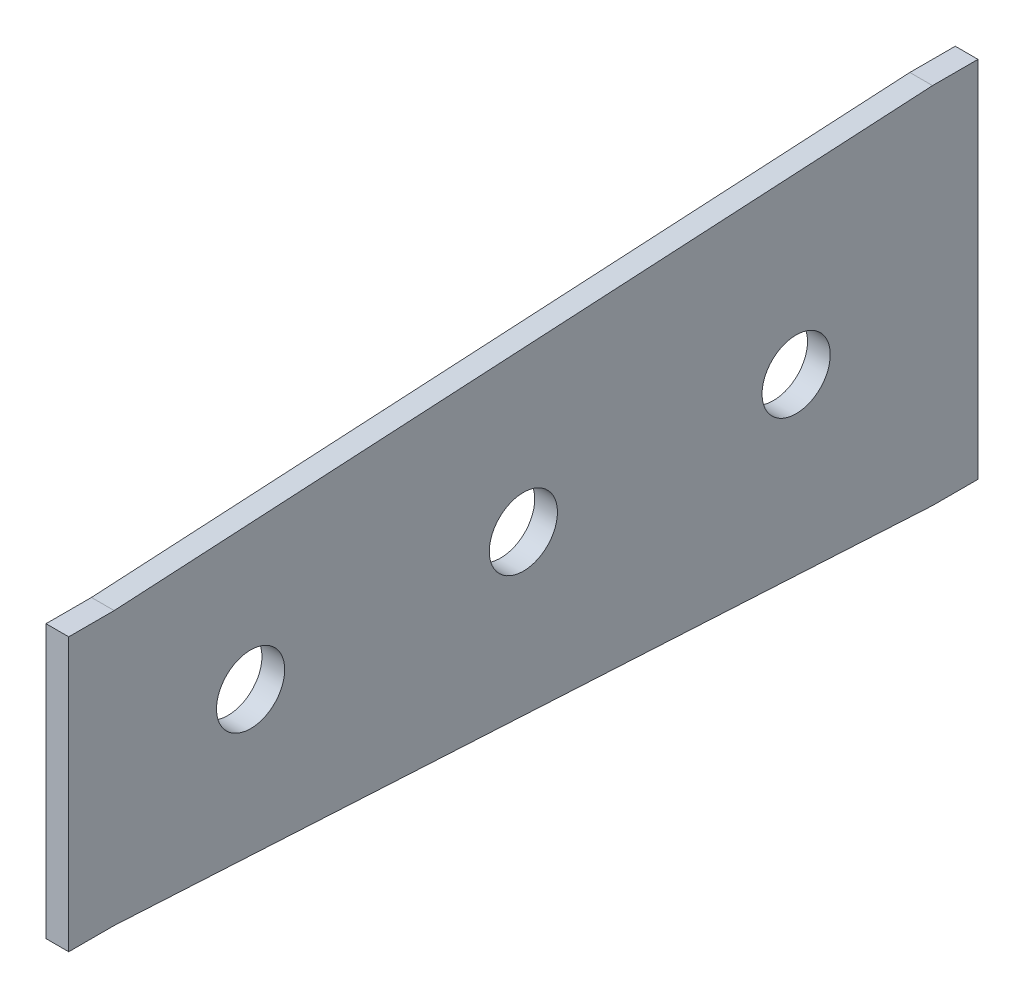
ISO-10303-21;
HEADER;
FILE_DESCRIPTION(('STEP AP214'),'2;1');
FILE_NAME('part.step','',(''),(''),'','','');
FILE_SCHEMA(('AUTOMOTIVE_DESIGN { 1 0 10303 214 1 1 1 1 }'));
ENDSEC;
DATA;
#1=APPLICATION_CONTEXT('core data for automotive mechanical design processes');
#2=APPLICATION_PROTOCOL_DEFINITION('international standard','automotive_design',2000,#1);
#3=PRODUCT_CONTEXT('',#1,'mechanical');
#4=PRODUCT('Part','Part','',(#3));
#5=PRODUCT_RELATED_PRODUCT_CATEGORY('part','',(#4));
#6=PRODUCT_DEFINITION_FORMATION('','',#4);
#7=PRODUCT_DEFINITION_CONTEXT('part definition',#1,'design');
#8=PRODUCT_DEFINITION('design','',#6,#7);
#9=PRODUCT_DEFINITION_SHAPE('','',#8);
#10=(LENGTH_UNIT() NAMED_UNIT(*) SI_UNIT(.MILLI.,.METRE.));
#11=(NAMED_UNIT(*) PLANE_ANGLE_UNIT() SI_UNIT($,.RADIAN.));
#12=(NAMED_UNIT(*) SI_UNIT($,.STERADIAN.) SOLID_ANGLE_UNIT());
#13=UNCERTAINTY_MEASURE_WITH_UNIT(LENGTH_MEASURE(1.E-05),#10,'distance_accuracy_value','');
#14=(GEOMETRIC_REPRESENTATION_CONTEXT(3) GLOBAL_UNCERTAINTY_ASSIGNED_CONTEXT((#13)) GLOBAL_UNIT_ASSIGNED_CONTEXT((#10,
#11,#12)) REPRESENTATION_CONTEXT('',''));
#15=CARTESIAN_POINT('',(0.,0.,0.));
#16=DIRECTION('',(0.,0.,1.));
#17=DIRECTION('',(1.,0.,0.));
#18=AXIS2_PLACEMENT_3D('',#15,#16,#17);
#19=CARTESIAN_POINT('',(2.5,0.,0.));
#20=DIRECTION('',(1.,0.,0.));
#21=DIRECTION('',(0.,0.,-1.));
#22=AXIS2_PLACEMENT_3D('',#19,#20,#21);
#23=PLANE('',#22);
#24=CARTESIAN_POINT('',(2.5,0.,60.));
#25=DIRECTION('',(1.,0.,0.));
#26=DIRECTION('',(0.,0.,-1.));
#27=AXIS2_PLACEMENT_3D('',#24,#25,#26);
#28=CIRCLE('',#27,7.50000000000001);
#29=CARTESIAN_POINT('',(2.5,0.,52.5));
#30=VERTEX_POINT('',#29);
#31=EDGE_CURVE('E188',#30,#30,#28,.T.);
#32=ORIENTED_EDGE('',*,*,#31,.F.);
#33=EDGE_LOOP('',(#32));
#34=FACE_BOUND('',#33,.T.);
#35=DIRECTION('',(0.,0.,1.));
#36=VECTOR('',#35,1.);
#37=CARTESIAN_POINT('',(2.5,30.,100.));
#38=LINE('',#37,#36);
#39=CARTESIAN_POINT('',(2.5,30.,90.));
#40=VERTEX_POINT('',#39);
#41=CARTESIAN_POINT('',(2.5,30.,100.));
#42=VERTEX_POINT('',#41);
#43=EDGE_CURVE('E150',#40,#42,#38,.T.);
#44=ORIENTED_EDGE('',*,*,#43,.T.);
#45=DIRECTION('',(0.,-1.,0.));
#46=VECTOR('',#45,1.);
#47=CARTESIAN_POINT('',(2.5,30.,100.));
#48=LINE('',#47,#46);
#49=CARTESIAN_POINT('',(2.5,-30.,100.));
#50=VERTEX_POINT('',#49);
#51=EDGE_CURVE('E97',#42,#50,#48,.T.);
#52=ORIENTED_EDGE('',*,*,#51,.T.);
#53=DIRECTION('',(0.,0.,-1.));
#54=VECTOR('',#53,1.);
#55=CARTESIAN_POINT('',(2.5,-30.,100.));
#56=LINE('',#55,#54);
#57=CARTESIAN_POINT('',(2.5,-30.,90.));
#58=VERTEX_POINT('',#57);
#59=EDGE_CURVE('E165',#50,#58,#56,.T.);
#60=ORIENTED_EDGE('',*,*,#59,.T.);
#61=DIRECTION('',(0.,-0.0554700196225229,-0.998460353205412));
#62=VECTOR('',#61,1.);
#63=CARTESIAN_POINT('',(2.5,-40.,-90.));
#64=LINE('',#63,#62);
#65=CARTESIAN_POINT('',(2.5,-40.,-90.));
#66=VERTEX_POINT('',#65);
#67=EDGE_CURVE('E178',#58,#66,#64,.T.);
#68=ORIENTED_EDGE('',*,*,#67,.T.);
#69=DIRECTION('',(0.,0.,-1.));
#70=VECTOR('',#69,1.);
#71=CARTESIAN_POINT('',(2.5,-40.,-100.));
#72=LINE('',#71,#70);
#73=CARTESIAN_POINT('',(2.5,-40.,-100.));
#74=VERTEX_POINT('',#73);
#75=EDGE_CURVE('E116',#66,#74,#72,.T.);
#76=ORIENTED_EDGE('',*,*,#75,.T.);
#77=DIRECTION('',(0.,1.,0.));
#78=VECTOR('',#77,1.);
#79=CARTESIAN_POINT('',(2.5,-40.,-100.));
#80=LINE('',#79,#78);
#81=CARTESIAN_POINT('',(2.5,40.,-100.));
#82=VERTEX_POINT('',#81);
#83=EDGE_CURVE('E110',#74,#82,#80,.T.);
#84=ORIENTED_EDGE('',*,*,#83,.T.);
#85=DIRECTION('',(0.,0.,1.));
#86=VECTOR('',#85,1.);
#87=CARTESIAN_POINT('',(2.5,40.,-100.));
#88=LINE('',#87,#86);
#89=CARTESIAN_POINT('',(2.5,40.,-90.));
#90=VERTEX_POINT('',#89);
#91=EDGE_CURVE('E114',#82,#90,#88,.T.);
#92=ORIENTED_EDGE('',*,*,#91,.T.);
#93=DIRECTION('',(0.,-0.0554700196225229,0.998460353205412));
#94=VECTOR('',#93,1.);
#95=CARTESIAN_POINT('',(2.5,40.,-90.));
#96=LINE('',#95,#94);
#97=EDGE_CURVE('E54',#90,#40,#96,.T.);
#98=ORIENTED_EDGE('',*,*,#97,.T.);
#99=EDGE_LOOP('',(#44,#52,#60,#68,#76,#84,#92,#98));
#100=FACE_BOUND('',#99,.T.);
#101=CARTESIAN_POINT('',(2.5,0.,0.));
#102=DIRECTION('',(1.,0.,0.));
#103=DIRECTION('',(0.,0.,-1.));
#104=AXIS2_PLACEMENT_3D('',#101,#102,#103);
#105=CIRCLE('',#104,7.5);
#106=CARTESIAN_POINT('',(2.5,0.,-7.5));
#107=VERTEX_POINT('',#106);
#108=EDGE_CURVE('E138',#107,#107,#105,.T.);
#109=ORIENTED_EDGE('',*,*,#108,.F.);
#110=EDGE_LOOP('',(#109));
#111=FACE_BOUND('',#110,.T.);
#112=CARTESIAN_POINT('',(2.5,0.,-60.));
#113=DIRECTION('',(1.,0.,0.));
#114=DIRECTION('',(0.,0.,-1.));
#115=AXIS2_PLACEMENT_3D('',#112,#113,#114);
#116=CIRCLE('',#115,7.50000000000001);
#117=CARTESIAN_POINT('',(2.5,0.,-67.5));
#118=VERTEX_POINT('',#117);
#119=EDGE_CURVE('E194',#118,#118,#116,.T.);
#120=ORIENTED_EDGE('',*,*,#119,.F.);
#121=EDGE_LOOP('',(#120));
#122=FACE_BOUND('',#121,.T.);
#123=ADVANCED_FACE('F37',(#34,#100,#111,#122),#23,.T.);
#124=CARTESIAN_POINT('',(-2.5,0.,0.));
#125=DIRECTION('',(1.,0.,0.));
#126=DIRECTION('',(0.,0.,-1.));
#127=AXIS2_PLACEMENT_3D('',#124,#125,#126);
#128=PLANE('',#127);
#129=DIRECTION('',(0.,0.,1.));
#130=VECTOR('',#129,1.);
#131=CARTESIAN_POINT('',(-2.5,30.,100.));
#132=LINE('',#131,#130);
#133=CARTESIAN_POINT('',(-2.5,30.,90.));
#134=VERTEX_POINT('',#133);
#135=CARTESIAN_POINT('',(-2.5,30.,100.));
#136=VERTEX_POINT('',#135);
#137=EDGE_CURVE('E134',#134,#136,#132,.T.);
#138=ORIENTED_EDGE('',*,*,#137,.F.);
#139=DIRECTION('',(0.,-0.0554700196225229,0.998460353205412));
#140=VECTOR('',#139,1.);
#141=CARTESIAN_POINT('',(-2.5,40.,-90.));
#142=LINE('',#141,#140);
#143=CARTESIAN_POINT('',(-2.5,40.,-90.));
#144=VERTEX_POINT('',#143);
#145=EDGE_CURVE('E89',#144,#134,#142,.T.);
#146=ORIENTED_EDGE('',*,*,#145,.F.);
#147=DIRECTION('',(0.,0.,1.));
#148=VECTOR('',#147,1.);
#149=CARTESIAN_POINT('',(-2.5,40.,-100.));
#150=LINE('',#149,#148);
#151=CARTESIAN_POINT('',(-2.5,40.,-100.));
#152=VERTEX_POINT('',#151);
#153=EDGE_CURVE('E83',#152,#144,#150,.T.);
#154=ORIENTED_EDGE('',*,*,#153,.F.);
#155=DIRECTION('',(0.,1.,0.));
#156=VECTOR('',#155,1.);
#157=CARTESIAN_POINT('',(-2.5,-40.,-100.));
#158=LINE('',#157,#156);
#159=CARTESIAN_POINT('',(-2.5,-40.,-100.));
#160=VERTEX_POINT('',#159);
#161=EDGE_CURVE('E124',#160,#152,#158,.T.);
#162=ORIENTED_EDGE('',*,*,#161,.F.);
#163=DIRECTION('',(0.,0.,-1.));
#164=VECTOR('',#163,1.);
#165=CARTESIAN_POINT('',(-2.5,-40.,-100.));
#166=LINE('',#165,#164);
#167=CARTESIAN_POINT('',(-2.5,-40.,-90.));
#168=VERTEX_POINT('',#167);
#169=EDGE_CURVE('E145',#168,#160,#166,.T.);
#170=ORIENTED_EDGE('',*,*,#169,.F.);
#171=DIRECTION('',(0.,-0.0554700196225229,-0.998460353205412));
#172=VECTOR('',#171,1.);
#173=CARTESIAN_POINT('',(-2.5,-40.,-90.));
#174=LINE('',#173,#172);
#175=CARTESIAN_POINT('',(-2.5,-30.,90.));
#176=VERTEX_POINT('',#175);
#177=EDGE_CURVE('E142',#176,#168,#174,.T.);
#178=ORIENTED_EDGE('',*,*,#177,.F.);
#179=DIRECTION('',(0.,0.,-1.));
#180=VECTOR('',#179,1.);
#181=CARTESIAN_POINT('',(-2.5,-30.,100.));
#182=LINE('',#181,#180);
#183=CARTESIAN_POINT('',(-2.5,-30.,100.));
#184=VERTEX_POINT('',#183);
#185=EDGE_CURVE('E140',#184,#176,#182,.T.);
#186=ORIENTED_EDGE('',*,*,#185,.F.);
#187=DIRECTION('',(0.,-1.,0.));
#188=VECTOR('',#187,1.);
#189=CARTESIAN_POINT('',(-2.5,30.,100.));
#190=LINE('',#189,#188);
#191=EDGE_CURVE('E137',#136,#184,#190,.T.);
#192=ORIENTED_EDGE('',*,*,#191,.F.);
#193=EDGE_LOOP('',(#138,#146,#154,#162,#170,#178,#186,#192));
#194=FACE_BOUND('',#193,.T.);
#195=CARTESIAN_POINT('',(-2.5,0.,0.));
#196=DIRECTION('',(1.,0.,0.));
#197=DIRECTION('',(0.,0.,-1.));
#198=AXIS2_PLACEMENT_3D('',#195,#196,#197);
#199=CIRCLE('',#198,7.5);
#200=CARTESIAN_POINT('',(-2.5,0.,-7.5));
#201=VERTEX_POINT('',#200);
#202=EDGE_CURVE('E185',#201,#201,#199,.T.);
#203=ORIENTED_EDGE('',*,*,#202,.T.);
#204=EDGE_LOOP('',(#203));
#205=FACE_BOUND('',#204,.T.);
#206=CARTESIAN_POINT('',(-2.5,0.,60.));
#207=DIRECTION('',(1.,0.,0.));
#208=DIRECTION('',(0.,0.,-1.));
#209=AXIS2_PLACEMENT_3D('',#206,#207,#208);
#210=CIRCLE('',#209,7.50000000000001);
#211=CARTESIAN_POINT('',(-2.5,0.,52.5));
#212=VERTEX_POINT('',#211);
#213=EDGE_CURVE('E191',#212,#212,#210,.T.);
#214=ORIENTED_EDGE('',*,*,#213,.T.);
#215=EDGE_LOOP('',(#214));
#216=FACE_BOUND('',#215,.T.);
#217=CARTESIAN_POINT('',(-2.5,0.,-60.));
#218=DIRECTION('',(1.,0.,0.));
#219=DIRECTION('',(0.,0.,-1.));
#220=AXIS2_PLACEMENT_3D('',#217,#218,#219);
#221=CIRCLE('',#220,7.50000000000001);
#222=CARTESIAN_POINT('',(-2.5,0.,-67.5));
#223=VERTEX_POINT('',#222);
#224=EDGE_CURVE('E197',#223,#223,#221,.T.);
#225=ORIENTED_EDGE('',*,*,#224,.T.);
#226=EDGE_LOOP('',(#225));
#227=FACE_BOUND('',#226,.T.);
#228=ADVANCED_FACE('F169',(#194,#205,#216,#227),#128,.F.);
#229=CARTESIAN_POINT('',(2.5,30.,100.));
#230=DIRECTION('',(0.,-1.,0.));
#231=DIRECTION('',(0.,0.,-1.));
#232=AXIS2_PLACEMENT_3D('',#229,#230,#231);
#233=PLANE('',#232);
#234=ORIENTED_EDGE('',*,*,#137,.T.);
#235=DIRECTION('',(-1.,0.,0.));
#236=VECTOR('',#235,1.);
#237=CARTESIAN_POINT('',(2.5,30.,100.));
#238=LINE('',#237,#236);
#239=EDGE_CURVE('E11',#42,#136,#238,.T.);
#240=ORIENTED_EDGE('',*,*,#239,.F.);
#241=ORIENTED_EDGE('',*,*,#43,.F.);
#242=DIRECTION('',(-1.,0.,0.));
#243=VECTOR('',#242,1.);
#244=CARTESIAN_POINT('',(2.5,30.,90.));
#245=LINE('',#244,#243);
#246=EDGE_CURVE('E130',#40,#134,#245,.T.);
#247=ORIENTED_EDGE('',*,*,#246,.T.);
#248=EDGE_LOOP('',(#234,#240,#241,#247));
#249=FACE_BOUND('',#248,.T.);
#250=ADVANCED_FACE('F39',(#249),#233,.F.);
#251=CARTESIAN_POINT('',(2.5,30.,100.));
#252=DIRECTION('',(0.,0.,-1.));
#253=DIRECTION('',(-1.,0.,0.));
#254=AXIS2_PLACEMENT_3D('',#251,#252,#253);
#255=PLANE('',#254);
#256=ORIENTED_EDGE('',*,*,#191,.T.);
#257=DIRECTION('',(-1.,0.,0.));
#258=VECTOR('',#257,1.);
#259=CARTESIAN_POINT('',(2.5,-30.,100.));
#260=LINE('',#259,#258);
#261=EDGE_CURVE('E46',#50,#184,#260,.T.);
#262=ORIENTED_EDGE('',*,*,#261,.F.);
#263=ORIENTED_EDGE('',*,*,#51,.F.);
#264=ORIENTED_EDGE('',*,*,#239,.T.);
#265=EDGE_LOOP('',(#256,#262,#263,#264));
#266=FACE_BOUND('',#265,.T.);
#267=ADVANCED_FACE('F232',(#266),#255,.F.);
#268=CARTESIAN_POINT('',(2.5,-30.,100.));
#269=DIRECTION('',(0.,1.,0.));
#270=DIRECTION('',(0.,0.,1.));
#271=AXIS2_PLACEMENT_3D('',#268,#269,#270);
#272=PLANE('',#271);
#273=ORIENTED_EDGE('',*,*,#185,.T.);
#274=DIRECTION('',(-1.,0.,0.));
#275=VECTOR('',#274,1.);
#276=CARTESIAN_POINT('',(2.5,-30.,90.));
#277=LINE('',#276,#275);
#278=EDGE_CURVE('E157',#58,#176,#277,.T.);
#279=ORIENTED_EDGE('',*,*,#278,.F.);
#280=ORIENTED_EDGE('',*,*,#59,.F.);
#281=ORIENTED_EDGE('',*,*,#261,.T.);
#282=EDGE_LOOP('',(#273,#279,#280,#281));
#283=FACE_BOUND('',#282,.T.);
#284=ADVANCED_FACE('F163',(#283),#272,.F.);
#285=CARTESIAN_POINT('',(2.5,-40.,-90.));
#286=DIRECTION('',(0.,0.998460353205412,-0.0554700196225229));
#287=DIRECTION('',(0.,0.0554700196225229,0.998460353205412));
#288=AXIS2_PLACEMENT_3D('',#285,#286,#287);
#289=PLANE('',#288);
#290=ORIENTED_EDGE('',*,*,#177,.T.);
#291=DIRECTION('',(-1.,0.,0.));
#292=VECTOR('',#291,1.);
#293=CARTESIAN_POINT('',(2.5,-40.,-90.));
#294=LINE('',#293,#292);
#295=EDGE_CURVE('E154',#66,#168,#294,.T.);
#296=ORIENTED_EDGE('',*,*,#295,.F.);
#297=ORIENTED_EDGE('',*,*,#67,.F.);
#298=ORIENTED_EDGE('',*,*,#278,.T.);
#299=EDGE_LOOP('',(#290,#296,#297,#298));
#300=FACE_BOUND('',#299,.T.);
#301=ADVANCED_FACE('F174',(#300),#289,.F.);
#302=CARTESIAN_POINT('',(2.5,-40.,-100.));
#303=DIRECTION('',(0.,1.,0.));
#304=DIRECTION('',(0.,0.,1.));
#305=AXIS2_PLACEMENT_3D('',#302,#303,#304);
#306=PLANE('',#305);
#307=ORIENTED_EDGE('',*,*,#169,.T.);
#308=DIRECTION('',(-1.,0.,0.));
#309=VECTOR('',#308,1.);
#310=CARTESIAN_POINT('',(2.5,-40.,-100.));
#311=LINE('',#310,#309);
#312=EDGE_CURVE('E125',#74,#160,#311,.T.);
#313=ORIENTED_EDGE('',*,*,#312,.F.);
#314=ORIENTED_EDGE('',*,*,#75,.F.);
#315=ORIENTED_EDGE('',*,*,#295,.T.);
#316=EDGE_LOOP('',(#307,#313,#314,#315));
#317=FACE_BOUND('',#316,.T.);
#318=ADVANCED_FACE('F177',(#317),#306,.F.);
#319=CARTESIAN_POINT('',(2.5,-40.,-100.));
#320=DIRECTION('',(0.,0.,1.));
#321=DIRECTION('',(1.,0.,0.));
#322=AXIS2_PLACEMENT_3D('',#319,#320,#321);
#323=PLANE('',#322);
#324=ORIENTED_EDGE('',*,*,#161,.T.);
#325=DIRECTION('',(-1.,0.,0.));
#326=VECTOR('',#325,1.);
#327=CARTESIAN_POINT('',(2.5,40.,-100.));
#328=LINE('',#327,#326);
#329=EDGE_CURVE('E121',#82,#152,#328,.T.);
#330=ORIENTED_EDGE('',*,*,#329,.F.);
#331=ORIENTED_EDGE('',*,*,#83,.F.);
#332=ORIENTED_EDGE('',*,*,#312,.T.);
#333=EDGE_LOOP('',(#324,#330,#331,#332));
#334=FACE_BOUND('',#333,.T.);
#335=ADVANCED_FACE('F122',(#334),#323,.F.);
#336=CARTESIAN_POINT('',(2.5,40.,-100.));
#337=DIRECTION('',(0.,-1.,0.));
#338=DIRECTION('',(0.,0.,-1.));
#339=AXIS2_PLACEMENT_3D('',#336,#337,#338);
#340=PLANE('',#339);
#341=ORIENTED_EDGE('',*,*,#153,.T.);
#342=DIRECTION('',(-1.,0.,0.));
#343=VECTOR('',#342,1.);
#344=CARTESIAN_POINT('',(2.5,40.,-90.));
#345=LINE('',#344,#343);
#346=EDGE_CURVE('E126',#90,#144,#345,.T.);
#347=ORIENTED_EDGE('',*,*,#346,.F.);
#348=ORIENTED_EDGE('',*,*,#91,.F.);
#349=ORIENTED_EDGE('',*,*,#329,.T.);
#350=EDGE_LOOP('',(#341,#347,#348,#349));
#351=FACE_BOUND('',#350,.T.);
#352=ADVANCED_FACE('F128',(#351),#340,.F.);
#353=CARTESIAN_POINT('',(2.5,40.,-90.));
#354=DIRECTION('',(0.,-0.998460353205412,-0.0554700196225229));
#355=DIRECTION('',(0.,0.0554700196225229,-0.998460353205412));
#356=AXIS2_PLACEMENT_3D('',#353,#354,#355);
#357=PLANE('',#356);
#358=ORIENTED_EDGE('',*,*,#145,.T.);
#359=ORIENTED_EDGE('',*,*,#246,.F.);
#360=ORIENTED_EDGE('',*,*,#97,.F.);
#361=ORIENTED_EDGE('',*,*,#346,.T.);
#362=EDGE_LOOP('',(#358,#359,#360,#361));
#363=FACE_BOUND('',#362,.T.);
#364=ADVANCED_FACE('F220',(#363),#357,.F.);
#365=CARTESIAN_POINT('',(2.5,0.,0.));
#366=DIRECTION('',(-1.,0.,0.));
#367=DIRECTION('',(0.,0.,1.));
#368=AXIS2_PLACEMENT_3D('',#365,#366,#367);
#369=CYLINDRICAL_SURFACE('',#368,7.5);
#370=ORIENTED_EDGE('',*,*,#108,.T.);
#371=EDGE_LOOP('',(#370));
#372=FACE_BOUND('',#371,.T.);
#373=ORIENTED_EDGE('',*,*,#202,.F.);
#374=EDGE_LOOP('',(#373));
#375=FACE_BOUND('',#374,.T.);
#376=ADVANCED_FACE('F217',(#372,#375),#369,.F.);
#377=CARTESIAN_POINT('',(2.5,0.,60.));
#378=DIRECTION('',(-1.,0.,0.));
#379=DIRECTION('',(0.,0.,1.));
#380=AXIS2_PLACEMENT_3D('',#377,#378,#379);
#381=CYLINDRICAL_SURFACE('',#380,7.50000000000001);
#382=ORIENTED_EDGE('',*,*,#31,.T.);
#383=EDGE_LOOP('',(#382));
#384=FACE_BOUND('',#383,.T.);
#385=ORIENTED_EDGE('',*,*,#213,.F.);
#386=EDGE_LOOP('',(#385));
#387=FACE_BOUND('',#386,.T.);
#388=ADVANCED_FACE('F253',(#384,#387),#381,.F.);
#389=CARTESIAN_POINT('',(2.5,0.,-60.));
#390=DIRECTION('',(-1.,0.,0.));
#391=DIRECTION('',(0.,0.,1.));
#392=AXIS2_PLACEMENT_3D('',#389,#390,#391);
#393=CYLINDRICAL_SURFACE('',#392,7.50000000000001);
#394=ORIENTED_EDGE('',*,*,#119,.T.);
#395=EDGE_LOOP('',(#394));
#396=FACE_BOUND('',#395,.T.);
#397=ORIENTED_EDGE('',*,*,#224,.F.);
#398=EDGE_LOOP('',(#397));
#399=FACE_BOUND('',#398,.T.);
#400=ADVANCED_FACE('F205',(#396,#399),#393,.F.);
#401=CLOSED_SHELL('',(#123,#228,#250,#267,#284,#301,#318,#335,#352,#364,#376,#388,#400));
#402=MANIFOLD_SOLID_BREP('B2',#401);
#403=ADVANCED_BREP_SHAPE_REPRESENTATION('',(#18,#402),#14);
#404=SHAPE_DEFINITION_REPRESENTATION(#9,#403);
ENDSEC;
END-ISO-10303-21;
